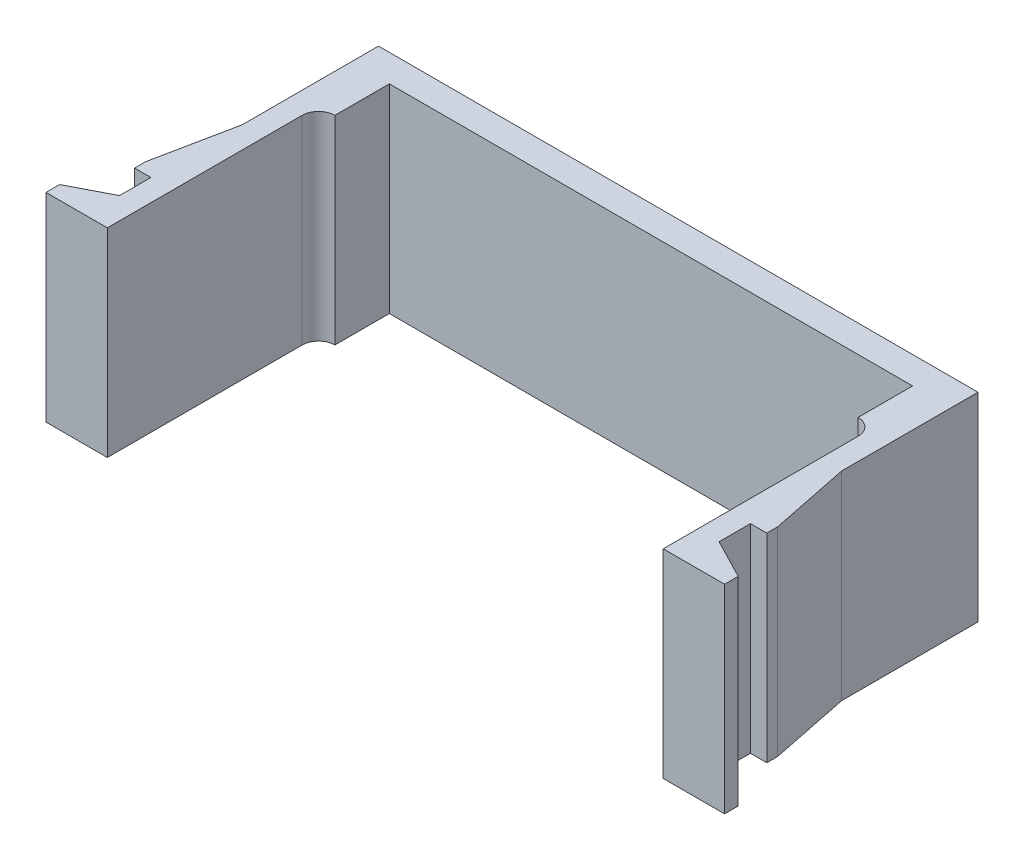
ISO-10303-21;
HEADER;
FILE_DESCRIPTION(('STEP AP214'),'2;1');
FILE_NAME('part.step','',(''),(''),'','','');
FILE_SCHEMA(('AUTOMOTIVE_DESIGN { 1 0 10303 214 1 1 1 1 }'));
ENDSEC;
DATA;
#1=APPLICATION_CONTEXT('core data for automotive mechanical design processes');
#2=APPLICATION_PROTOCOL_DEFINITION('international standard','automotive_design',2000,#1);
#3=PRODUCT_CONTEXT('',#1,'mechanical');
#4=PRODUCT('Part','Part','',(#3));
#5=PRODUCT_RELATED_PRODUCT_CATEGORY('part','',(#4));
#6=PRODUCT_DEFINITION_FORMATION('','',#4);
#7=PRODUCT_DEFINITION_CONTEXT('part definition',#1,'design');
#8=PRODUCT_DEFINITION('design','',#6,#7);
#9=PRODUCT_DEFINITION_SHAPE('','',#8);
#10=(LENGTH_UNIT() NAMED_UNIT(*) SI_UNIT(.MILLI.,.METRE.));
#11=(NAMED_UNIT(*) PLANE_ANGLE_UNIT() SI_UNIT($,.RADIAN.));
#12=(NAMED_UNIT(*) SI_UNIT($,.STERADIAN.) SOLID_ANGLE_UNIT());
#13=UNCERTAINTY_MEASURE_WITH_UNIT(LENGTH_MEASURE(1.E-05),#10,'distance_accuracy_value','');
#14=(GEOMETRIC_REPRESENTATION_CONTEXT(3) GLOBAL_UNCERTAINTY_ASSIGNED_CONTEXT((#13)) GLOBAL_UNIT_ASSIGNED_CONTEXT((#10,
#11,#12)) REPRESENTATION_CONTEXT('',''));
#15=CARTESIAN_POINT('',(0.,0.,0.));
#16=DIRECTION('',(0.,0.,1.));
#17=DIRECTION('',(1.,0.,0.));
#18=AXIS2_PLACEMENT_3D('',#15,#16,#17);
#19=CARTESIAN_POINT('',(0.,0.,2.));
#20=DIRECTION('',(0.,0.,-1.));
#21=DIRECTION('',(-1.,0.,0.));
#22=AXIS2_PLACEMENT_3D('',#19,#20,#21);
#23=PLANE('',#22);
#24=DIRECTION('',(-1.,0.,0.));
#25=VECTOR('',#24,1.);
#26=CARTESIAN_POINT('',(-22.,7.3,2.));
#27=LINE('',#26,#25);
#28=CARTESIAN_POINT('',(19.2,7.3,2.));
#29=VERTEX_POINT('',#28);
#30=CARTESIAN_POINT('',(-19.2,7.3,2.));
#31=VERTEX_POINT('',#30);
#32=EDGE_CURVE('E330',#29,#31,#27,.T.);
#33=ORIENTED_EDGE('',*,*,#32,.T.);
#34=DIRECTION('',(0.,-1.,0.));
#35=VECTOR('',#34,1.);
#36=CARTESIAN_POINT('',(-19.2,-7.3,2.));
#37=LINE('',#36,#35);
#38=CARTESIAN_POINT('',(-19.2,-7.3,2.));
#39=VERTEX_POINT('',#38);
#40=EDGE_CURVE('E251',#31,#39,#37,.T.);
#41=ORIENTED_EDGE('',*,*,#40,.T.);
#42=DIRECTION('',(1.,0.,0.));
#43=VECTOR('',#42,1.);
#44=CARTESIAN_POINT('',(-22.,-7.3,2.));
#45=LINE('',#44,#43);
#46=CARTESIAN_POINT('',(19.2,-7.3,2.));
#47=VERTEX_POINT('',#46);
#48=EDGE_CURVE('E332',#39,#47,#45,.T.);
#49=ORIENTED_EDGE('',*,*,#48,.T.);
#50=DIRECTION('',(0.,-1.,0.));
#51=VECTOR('',#50,1.);
#52=CARTESIAN_POINT('',(19.2,-7.3,2.));
#53=LINE('',#52,#51);
#54=EDGE_CURVE('E317',#29,#47,#53,.T.);
#55=ORIENTED_EDGE('',*,*,#54,.F.);
#56=EDGE_LOOP('',(#33,#41,#49,#55));
#57=FACE_BOUND('',#56,.T.);
#58=ADVANCED_FACE('F35',(#57),#23,.F.);
#59=CARTESIAN_POINT('',(22.,-7.3,2.));
#60=DIRECTION('',(-1.,0.,0.));
#61=DIRECTION('',(0.,0.,1.));
#62=AXIS2_PLACEMENT_3D('',#59,#60,#61);
#63=PLANE('',#62);
#64=DIRECTION('',(0.,1.,0.));
#65=VECTOR('',#64,1.);
#66=CARTESIAN_POINT('',(22.,-7.3,0.));
#67=LINE('',#66,#65);
#68=CARTESIAN_POINT('',(22.,-7.3,0.));
#69=VERTEX_POINT('',#68);
#70=CARTESIAN_POINT('',(22.,7.3,0.));
#71=VERTEX_POINT('',#70);
#72=EDGE_CURVE('E329',#69,#71,#67,.T.);
#73=ORIENTED_EDGE('',*,*,#72,.T.);
#74=DIRECTION('',(0.,0.,-1.));
#75=VECTOR('',#74,1.);
#76=CARTESIAN_POINT('',(22.,7.3,2.));
#77=LINE('',#76,#75);
#78=CARTESIAN_POINT('',(22.,7.3,10.));
#79=VERTEX_POINT('',#78);
#80=EDGE_CURVE('E351',#79,#71,#77,.T.);
#81=ORIENTED_EDGE('',*,*,#80,.F.);
#82=DIRECTION('',(0.,-1.,0.));
#83=VECTOR('',#82,1.);
#84=CARTESIAN_POINT('',(22.,23.440012391569,10.));
#85=LINE('',#84,#83);
#86=CARTESIAN_POINT('',(22.,-7.3,10.));
#87=VERTEX_POINT('',#86);
#88=EDGE_CURVE('E299',#79,#87,#85,.T.);
#89=ORIENTED_EDGE('',*,*,#88,.T.);
#90=DIRECTION('',(0.,0.,-1.));
#91=VECTOR('',#90,1.);
#92=CARTESIAN_POINT('',(22.,-7.3,2.));
#93=LINE('',#92,#91);
#94=EDGE_CURVE('E335',#87,#69,#93,.T.);
#95=ORIENTED_EDGE('',*,*,#94,.T.);
#96=EDGE_LOOP('',(#73,#81,#89,#95));
#97=FACE_BOUND('',#96,.T.);
#98=ADVANCED_FACE('F395',(#97),#63,.F.);
#99=CARTESIAN_POINT('',(-22.,7.3,2.));
#100=DIRECTION('',(0.,-1.,0.));
#101=DIRECTION('',(0.,0.,-1.));
#102=AXIS2_PLACEMENT_3D('',#99,#100,#101);
#103=PLANE('',#102);
#104=DIRECTION('',(-1.,0.,0.));
#105=VECTOR('',#104,1.);
#106=CARTESIAN_POINT('',(-22.,7.3,0.));
#107=LINE('',#106,#105);
#108=CARTESIAN_POINT('',(-22.,7.3,0.));
#109=VERTEX_POINT('',#108);
#110=EDGE_CURVE('E338',#71,#109,#107,.T.);
#111=ORIENTED_EDGE('',*,*,#110,.T.);
#112=DIRECTION('',(0.,0.,-1.));
#113=VECTOR('',#112,1.);
#114=CARTESIAN_POINT('',(-22.,7.3,2.));
#115=LINE('',#114,#113);
#116=CARTESIAN_POINT('',(-22.,7.3,10.));
#117=VERTEX_POINT('',#116);
#118=EDGE_CURVE('E348',#117,#109,#115,.T.);
#119=ORIENTED_EDGE('',*,*,#118,.F.);
#120=DIRECTION('',(0.199309151648976,0.,-0.979936662274132));
#121=VECTOR('',#120,1.);
#122=CARTESIAN_POINT('',(-23.2,7.3,15.9));
#123=LINE('',#122,#121);
#124=CARTESIAN_POINT('',(-23.2,7.3,15.9));
#125=VERTEX_POINT('',#124);
#126=EDGE_CURVE('E215',#125,#117,#123,.T.);
#127=ORIENTED_EDGE('',*,*,#126,.F.);
#128=DIRECTION('',(0.,0.,-1.));
#129=VECTOR('',#128,1.);
#130=CARTESIAN_POINT('',(-23.2,7.3,16.7));
#131=LINE('',#130,#129);
#132=CARTESIAN_POINT('',(-23.2,7.3,16.7));
#133=VERTEX_POINT('',#132);
#134=EDGE_CURVE('E481',#133,#125,#131,.T.);
#135=ORIENTED_EDGE('',*,*,#134,.F.);
#136=DIRECTION('',(-1.,0.,0.));
#137=VECTOR('',#136,1.);
#138=CARTESIAN_POINT('',(-22.,7.3,16.7));
#139=LINE('',#138,#137);
#140=CARTESIAN_POINT('',(-22.,7.3,16.7));
#141=VERTEX_POINT('',#140);
#142=EDGE_CURVE('E485',#141,#133,#139,.T.);
#143=ORIENTED_EDGE('',*,*,#142,.F.);
#144=DIRECTION('',(0.,0.,-1.));
#145=VECTOR('',#144,1.);
#146=CARTESIAN_POINT('',(-22.,7.3,19.));
#147=LINE('',#146,#145);
#148=CARTESIAN_POINT('',(-22.,7.3,19.));
#149=VERTEX_POINT('',#148);
#150=EDGE_CURVE('E487',#149,#141,#147,.T.);
#151=ORIENTED_EDGE('',*,*,#150,.F.);
#152=DIRECTION('',(0.888217643155949,0.,-0.459422918873766));
#153=VECTOR('',#152,1.);
#154=CARTESIAN_POINT('',(-24.9,7.3,20.5));
#155=LINE('',#154,#153);
#156=CARTESIAN_POINT('',(-24.9,7.3,20.5));
#157=VERTEX_POINT('',#156);
#158=EDGE_CURVE('E489',#157,#149,#155,.T.);
#159=ORIENTED_EDGE('',*,*,#158,.F.);
#160=DIRECTION('',(0.,0.,-1.));
#161=VECTOR('',#160,1.);
#162=CARTESIAN_POINT('',(-24.9,7.3,21.5));
#163=LINE('',#162,#161);
#164=CARTESIAN_POINT('',(-24.9,7.3,21.5));
#165=VERTEX_POINT('',#164);
#166=EDGE_CURVE('E494',#165,#157,#163,.T.);
#167=ORIENTED_EDGE('',*,*,#166,.F.);
#168=DIRECTION('',(-1.,0.,0.));
#169=VECTOR('',#168,1.);
#170=CARTESIAN_POINT('',(-20.4,7.3,21.5));
#171=LINE('',#170,#169);
#172=CARTESIAN_POINT('',(-20.4,7.3,21.5));
#173=VERTEX_POINT('',#172);
#174=EDGE_CURVE('E497',#173,#165,#171,.T.);
#175=ORIENTED_EDGE('',*,*,#174,.F.);
#176=DIRECTION('',(0.,0.,1.));
#177=VECTOR('',#176,1.);
#178=CARTESIAN_POINT('',(-20.4,7.3,6.));
#179=LINE('',#178,#177);
#180=CARTESIAN_POINT('',(-20.4,7.3,7.2));
#181=VERTEX_POINT('',#180);
#182=EDGE_CURVE('E197',#181,#173,#179,.T.);
#183=ORIENTED_EDGE('',*,*,#182,.F.);
#184=CARTESIAN_POINT('',(-19.2,7.3,7.2));
#185=DIRECTION('',(0.,-1.,0.));
#186=DIRECTION('',(0.,0.,-1.));
#187=AXIS2_PLACEMENT_3D('',#184,#185,#186);
#188=CIRCLE('',#187,1.2);
#189=CARTESIAN_POINT('',(-19.2,7.3,6.));
#190=VERTEX_POINT('',#189);
#191=EDGE_CURVE('E11',#181,#190,#188,.T.);
#192=ORIENTED_EDGE('',*,*,#191,.T.);
#193=DIRECTION('',(0.,0.,-1.));
#194=VECTOR('',#193,1.);
#195=CARTESIAN_POINT('',(-19.2,7.3,6.));
#196=LINE('',#195,#194);
#197=EDGE_CURVE('E250',#190,#31,#196,.T.);
#198=ORIENTED_EDGE('',*,*,#197,.T.);
#199=ORIENTED_EDGE('',*,*,#32,.F.);
#200=DIRECTION('',(0.,0.,-1.));
#201=VECTOR('',#200,1.);
#202=CARTESIAN_POINT('',(19.2,7.3,6.));
#203=LINE('',#202,#201);
#204=CARTESIAN_POINT('',(19.2,7.3,6.));
#205=VERTEX_POINT('',#204);
#206=EDGE_CURVE('E326',#205,#29,#203,.T.);
#207=ORIENTED_EDGE('',*,*,#206,.F.);
#208=CARTESIAN_POINT('',(19.2,7.3,7.2));
#209=DIRECTION('',(0.,-1.,0.));
#210=DIRECTION('',(0.,0.,-1.));
#211=AXIS2_PLACEMENT_3D('',#208,#209,#210);
#212=CIRCLE('',#211,1.2);
#213=CARTESIAN_POINT('',(20.4,7.3,7.2));
#214=VERTEX_POINT('',#213);
#215=EDGE_CURVE('E359',#205,#214,#212,.T.);
#216=ORIENTED_EDGE('',*,*,#215,.T.);
#217=DIRECTION('',(0.,0.,1.));
#218=VECTOR('',#217,1.);
#219=CARTESIAN_POINT('',(20.4,7.3,6.));
#220=LINE('',#219,#218);
#221=CARTESIAN_POINT('',(20.4,7.3,21.5));
#222=VERTEX_POINT('',#221);
#223=EDGE_CURVE('E273',#214,#222,#220,.T.);
#224=ORIENTED_EDGE('',*,*,#223,.T.);
#225=DIRECTION('',(1.,0.,0.));
#226=VECTOR('',#225,1.);
#227=CARTESIAN_POINT('',(20.4,7.3,21.5));
#228=LINE('',#227,#226);
#229=CARTESIAN_POINT('',(24.9,7.3,21.5));
#230=VERTEX_POINT('',#229);
#231=EDGE_CURVE('E271',#222,#230,#228,.T.);
#232=ORIENTED_EDGE('',*,*,#231,.T.);
#233=DIRECTION('',(0.,0.,-1.));
#234=VECTOR('',#233,1.);
#235=CARTESIAN_POINT('',(24.9,7.3,21.5));
#236=LINE('',#235,#234);
#237=CARTESIAN_POINT('',(24.9,7.3,20.5));
#238=VERTEX_POINT('',#237);
#239=EDGE_CURVE('E269',#230,#238,#236,.T.);
#240=ORIENTED_EDGE('',*,*,#239,.T.);
#241=DIRECTION('',(-0.888217643155949,0.,-0.459422918873766));
#242=VECTOR('',#241,1.);
#243=CARTESIAN_POINT('',(24.9,7.3,20.5));
#244=LINE('',#243,#242);
#245=CARTESIAN_POINT('',(22.,7.3,19.));
#246=VERTEX_POINT('',#245);
#247=EDGE_CURVE('E267',#238,#246,#244,.T.);
#248=ORIENTED_EDGE('',*,*,#247,.T.);
#249=DIRECTION('',(0.,0.,-1.));
#250=VECTOR('',#249,1.);
#251=CARTESIAN_POINT('',(22.,7.3,19.));
#252=LINE('',#251,#250);
#253=CARTESIAN_POINT('',(22.,7.3,16.7));
#254=VERTEX_POINT('',#253);
#255=EDGE_CURVE('E265',#246,#254,#252,.T.);
#256=ORIENTED_EDGE('',*,*,#255,.T.);
#257=DIRECTION('',(1.,0.,0.));
#258=VECTOR('',#257,1.);
#259=CARTESIAN_POINT('',(22.,7.3,16.7));
#260=LINE('',#259,#258);
#261=CARTESIAN_POINT('',(23.2,7.3,16.7));
#262=VERTEX_POINT('',#261);
#263=EDGE_CURVE('E262',#254,#262,#260,.T.);
#264=ORIENTED_EDGE('',*,*,#263,.T.);
#265=DIRECTION('',(0.,0.,-1.));
#266=VECTOR('',#265,1.);
#267=CARTESIAN_POINT('',(23.2,7.3,16.7));
#268=LINE('',#267,#266);
#269=CARTESIAN_POINT('',(23.2,7.3,15.9));
#270=VERTEX_POINT('',#269);
#271=EDGE_CURVE('E260',#262,#270,#268,.T.);
#272=ORIENTED_EDGE('',*,*,#271,.T.);
#273=DIRECTION('',(-0.199309151648976,0.,-0.979936662274132));
#274=VECTOR('',#273,1.);
#275=CARTESIAN_POINT('',(23.2,7.3,15.9));
#276=LINE('',#275,#274);
#277=EDGE_CURVE('E275',#270,#79,#276,.T.);
#278=ORIENTED_EDGE('',*,*,#277,.T.);
#279=ORIENTED_EDGE('',*,*,#80,.T.);
#280=EDGE_LOOP('',(#111,#119,#127,#135,#143,#151,#159,#167,#175,#183,#192,#198,#199,#207,#216,
#224,#232,#240,#248,#256,#264,#272,#278,#279));
#281=FACE_BOUND('',#280,.T.);
#282=ADVANCED_FACE('F364',(#281),#103,.F.);
#283=CARTESIAN_POINT('',(-22.,-7.3,2.));
#284=DIRECTION('',(1.,0.,0.));
#285=DIRECTION('',(0.,0.,-1.));
#286=AXIS2_PLACEMENT_3D('',#283,#284,#285);
#287=PLANE('',#286);
#288=DIRECTION('',(0.,-1.,0.));
#289=VECTOR('',#288,1.);
#290=CARTESIAN_POINT('',(-22.,-7.3,0.));
#291=LINE('',#290,#289);
#292=CARTESIAN_POINT('',(-22.,-7.3,0.));
#293=VERTEX_POINT('',#292);
#294=EDGE_CURVE('E340',#109,#293,#291,.T.);
#295=ORIENTED_EDGE('',*,*,#294,.T.);
#296=DIRECTION('',(0.,0.,-1.));
#297=VECTOR('',#296,1.);
#298=CARTESIAN_POINT('',(-22.,-7.3,2.));
#299=LINE('',#298,#297);
#300=CARTESIAN_POINT('',(-22.,-7.3,10.));
#301=VERTEX_POINT('',#300);
#302=EDGE_CURVE('E345',#301,#293,#299,.T.);
#303=ORIENTED_EDGE('',*,*,#302,.F.);
#304=DIRECTION('',(0.,-1.,0.));
#305=VECTOR('',#304,1.);
#306=CARTESIAN_POINT('',(-22.,23.440012391569,10.));
#307=LINE('',#306,#305);
#308=EDGE_CURVE('E233',#117,#301,#307,.T.);
#309=ORIENTED_EDGE('',*,*,#308,.F.);
#310=ORIENTED_EDGE('',*,*,#118,.T.);
#311=EDGE_LOOP('',(#295,#303,#309,#310));
#312=FACE_BOUND('',#311,.T.);
#313=ADVANCED_FACE('F411',(#312),#287,.F.);
#314=CARTESIAN_POINT('',(-22.,-7.3,2.));
#315=DIRECTION('',(0.,1.,0.));
#316=DIRECTION('',(0.,0.,1.));
#317=AXIS2_PLACEMENT_3D('',#314,#315,#316);
#318=PLANE('',#317);
#319=DIRECTION('',(1.,0.,0.));
#320=VECTOR('',#319,1.);
#321=CARTESIAN_POINT('',(-22.,-7.3,0.));
#322=LINE('',#321,#320);
#323=EDGE_CURVE('E333',#293,#69,#322,.T.);
#324=ORIENTED_EDGE('',*,*,#323,.T.);
#325=ORIENTED_EDGE('',*,*,#94,.F.);
#326=DIRECTION('',(0.199309151648976,0.,0.979936662274132));
#327=VECTOR('',#326,1.);
#328=CARTESIAN_POINT('',(23.2,-7.3,15.9));
#329=LINE('',#328,#327);
#330=CARTESIAN_POINT('',(23.2,-7.3,15.9));
#331=VERTEX_POINT('',#330);
#332=EDGE_CURVE('E259',#87,#331,#329,.T.);
#333=ORIENTED_EDGE('',*,*,#332,.T.);
#334=DIRECTION('',(0.,0.,1.));
#335=VECTOR('',#334,1.);
#336=CARTESIAN_POINT('',(23.2,-7.3,16.7));
#337=LINE('',#336,#335);
#338=CARTESIAN_POINT('',(23.2,-7.3,16.7));
#339=VERTEX_POINT('',#338);
#340=EDGE_CURVE('E278',#331,#339,#337,.T.);
#341=ORIENTED_EDGE('',*,*,#340,.T.);
#342=DIRECTION('',(-1.,0.,0.));
#343=VECTOR('',#342,1.);
#344=CARTESIAN_POINT('',(22.,-7.3,16.7));
#345=LINE('',#344,#343);
#346=CARTESIAN_POINT('',(22.,-7.3,16.7));
#347=VERTEX_POINT('',#346);
#348=EDGE_CURVE('E281',#339,#347,#345,.T.);
#349=ORIENTED_EDGE('',*,*,#348,.T.);
#350=DIRECTION('',(0.,0.,1.));
#351=VECTOR('',#350,1.);
#352=CARTESIAN_POINT('',(22.,-7.3,19.));
#353=LINE('',#352,#351);
#354=CARTESIAN_POINT('',(22.,-7.3,19.));
#355=VERTEX_POINT('',#354);
#356=EDGE_CURVE('E284',#347,#355,#353,.T.);
#357=ORIENTED_EDGE('',*,*,#356,.T.);
#358=DIRECTION('',(0.888217643155949,0.,0.459422918873766));
#359=VECTOR('',#358,1.);
#360=CARTESIAN_POINT('',(24.9,-7.3,20.5));
#361=LINE('',#360,#359);
#362=CARTESIAN_POINT('',(24.9,-7.3,20.5));
#363=VERTEX_POINT('',#362);
#364=EDGE_CURVE('E287',#355,#363,#361,.T.);
#365=ORIENTED_EDGE('',*,*,#364,.T.);
#366=DIRECTION('',(0.,0.,1.));
#367=VECTOR('',#366,1.);
#368=CARTESIAN_POINT('',(24.9,-7.3,21.5));
#369=LINE('',#368,#367);
#370=CARTESIAN_POINT('',(24.9,-7.3,21.5));
#371=VERTEX_POINT('',#370);
#372=EDGE_CURVE('E290',#363,#371,#369,.T.);
#373=ORIENTED_EDGE('',*,*,#372,.T.);
#374=DIRECTION('',(-1.,0.,0.));
#375=VECTOR('',#374,1.);
#376=CARTESIAN_POINT('',(20.4,-7.3,21.5));
#377=LINE('',#376,#375);
#378=CARTESIAN_POINT('',(20.4,-7.3,21.5));
#379=VERTEX_POINT('',#378);
#380=EDGE_CURVE('E293',#371,#379,#377,.T.);
#381=ORIENTED_EDGE('',*,*,#380,.T.);
#382=DIRECTION('',(0.,0.,-1.));
#383=VECTOR('',#382,1.);
#384=CARTESIAN_POINT('',(20.4,-7.3,6.));
#385=LINE('',#384,#383);
#386=CARTESIAN_POINT('',(20.4,-7.3,7.2));
#387=VERTEX_POINT('',#386);
#388=EDGE_CURVE('E296',#379,#387,#385,.T.);
#389=ORIENTED_EDGE('',*,*,#388,.T.);
#390=CARTESIAN_POINT('',(19.2,-7.3,7.2));
#391=DIRECTION('',(0.,1.,0.));
#392=DIRECTION('',(0.,0.,1.));
#393=AXIS2_PLACEMENT_3D('',#390,#391,#392);
#394=CIRCLE('',#393,1.2);
#395=CARTESIAN_POINT('',(19.2,-7.3,6.));
#396=VERTEX_POINT('',#395);
#397=EDGE_CURVE('E357',#387,#396,#394,.T.);
#398=ORIENTED_EDGE('',*,*,#397,.T.);
#399=DIRECTION('',(0.,0.,-1.));
#400=VECTOR('',#399,1.);
#401=CARTESIAN_POINT('',(19.2,-7.3,6.));
#402=LINE('',#401,#400);
#403=EDGE_CURVE('E321',#396,#47,#402,.T.);
#404=ORIENTED_EDGE('',*,*,#403,.T.);
#405=ORIENTED_EDGE('',*,*,#48,.F.);
#406=DIRECTION('',(0.,0.,-1.));
#407=VECTOR('',#406,1.);
#408=CARTESIAN_POINT('',(-19.2,-7.3,6.));
#409=LINE('',#408,#407);
#410=CARTESIAN_POINT('',(-19.2,-7.3,6.));
#411=VERTEX_POINT('',#410);
#412=EDGE_CURVE('E256',#411,#39,#409,.T.);
#413=ORIENTED_EDGE('',*,*,#412,.F.);
#414=CARTESIAN_POINT('',(-19.2,-7.3,7.2));
#415=DIRECTION('',(0.,1.,0.));
#416=DIRECTION('',(0.,0.,1.));
#417=AXIS2_PLACEMENT_3D('',#414,#415,#416);
#418=CIRCLE('',#417,1.2);
#419=CARTESIAN_POINT('',(-20.4,-7.3,7.2));
#420=VERTEX_POINT('',#419);
#421=EDGE_CURVE('E43',#411,#420,#418,.T.);
#422=ORIENTED_EDGE('',*,*,#421,.T.);
#423=DIRECTION('',(0.,0.,-1.));
#424=VECTOR('',#423,1.);
#425=CARTESIAN_POINT('',(-20.4,-7.3,6.));
#426=LINE('',#425,#424);
#427=CARTESIAN_POINT('',(-20.4,-7.3,21.5));
#428=VERTEX_POINT('',#427);
#429=EDGE_CURVE('E196',#428,#420,#426,.T.);
#430=ORIENTED_EDGE('',*,*,#429,.F.);
#431=DIRECTION('',(1.,0.,0.));
#432=VECTOR('',#431,1.);
#433=CARTESIAN_POINT('',(-20.4,-7.3,21.5));
#434=LINE('',#433,#432);
#435=CARTESIAN_POINT('',(-24.9,-7.3,21.5));
#436=VERTEX_POINT('',#435);
#437=EDGE_CURVE('E205',#436,#428,#434,.T.);
#438=ORIENTED_EDGE('',*,*,#437,.F.);
#439=DIRECTION('',(0.,0.,1.));
#440=VECTOR('',#439,1.);
#441=CARTESIAN_POINT('',(-24.9,-7.3,21.5));
#442=LINE('',#441,#440);
#443=CARTESIAN_POINT('',(-24.9,-7.3,20.5));
#444=VERTEX_POINT('',#443);
#445=EDGE_CURVE('E210',#444,#436,#442,.T.);
#446=ORIENTED_EDGE('',*,*,#445,.F.);
#447=DIRECTION('',(-0.888217643155949,0.,0.459422918873766));
#448=VECTOR('',#447,1.);
#449=CARTESIAN_POINT('',(-24.9,-7.3,20.5));
#450=LINE('',#449,#448);
#451=CARTESIAN_POINT('',(-22.,-7.3,19.));
#452=VERTEX_POINT('',#451);
#453=EDGE_CURVE('E219',#452,#444,#450,.T.);
#454=ORIENTED_EDGE('',*,*,#453,.F.);
#455=DIRECTION('',(0.,0.,1.));
#456=VECTOR('',#455,1.);
#457=CARTESIAN_POINT('',(-22.,-7.3,19.));
#458=LINE('',#457,#456);
#459=CARTESIAN_POINT('',(-22.,-7.3,16.7));
#460=VERTEX_POINT('',#459);
#461=EDGE_CURVE('E222',#460,#452,#458,.T.);
#462=ORIENTED_EDGE('',*,*,#461,.F.);
#463=DIRECTION('',(1.,0.,0.));
#464=VECTOR('',#463,1.);
#465=CARTESIAN_POINT('',(-22.,-7.3,16.7));
#466=LINE('',#465,#464);
#467=CARTESIAN_POINT('',(-23.2,-7.3,16.7));
#468=VERTEX_POINT('',#467);
#469=EDGE_CURVE('E225',#468,#460,#466,.T.);
#470=ORIENTED_EDGE('',*,*,#469,.F.);
#471=DIRECTION('',(0.,0.,1.));
#472=VECTOR('',#471,1.);
#473=CARTESIAN_POINT('',(-23.2,-7.3,16.7));
#474=LINE('',#473,#472);
#475=CARTESIAN_POINT('',(-23.2,-7.3,15.9));
#476=VERTEX_POINT('',#475);
#477=EDGE_CURVE('E228',#476,#468,#474,.T.);
#478=ORIENTED_EDGE('',*,*,#477,.F.);
#479=DIRECTION('',(-0.199309151648976,0.,0.979936662274132));
#480=VECTOR('',#479,1.);
#481=CARTESIAN_POINT('',(-23.2,-7.3,15.9));
#482=LINE('',#481,#480);
#483=EDGE_CURVE('E202',#301,#476,#482,.T.);
#484=ORIENTED_EDGE('',*,*,#483,.F.);
#485=ORIENTED_EDGE('',*,*,#302,.T.);
#486=EDGE_LOOP('',(#324,#325,#333,#341,#349,#357,#365,#373,#381,#389,#398,#404,#405,#413,#422,
#430,#438,#446,#454,#462,#470,#478,#484,#485));
#487=FACE_BOUND('',#486,.T.);
#488=ADVANCED_FACE('F212',(#487),#318,.F.);
#489=CARTESIAN_POINT('',(0.,0.,0.));
#490=DIRECTION('',(0.,0.,-1.));
#491=DIRECTION('',(-1.,0.,0.));
#492=AXIS2_PLACEMENT_3D('',#489,#490,#491);
#493=PLANE('',#492);
#494=ORIENTED_EDGE('',*,*,#72,.F.);
#495=ORIENTED_EDGE('',*,*,#323,.F.);
#496=ORIENTED_EDGE('',*,*,#294,.F.);
#497=ORIENTED_EDGE('',*,*,#110,.F.);
#498=EDGE_LOOP('',(#494,#495,#496,#497));
#499=FACE_BOUND('',#498,.T.);
#500=ADVANCED_FACE('F405',(#499),#493,.T.);
#501=CARTESIAN_POINT('',(19.2,-7.3,6.));
#502=DIRECTION('',(1.,0.,0.));
#503=DIRECTION('',(0.,0.,-1.));
#504=AXIS2_PLACEMENT_3D('',#501,#502,#503);
#505=PLANE('',#504);
#506=ORIENTED_EDGE('',*,*,#54,.T.);
#507=ORIENTED_EDGE('',*,*,#403,.F.);
#508=DIRECTION('',(0.,-1.,0.));
#509=VECTOR('',#508,1.);
#510=CARTESIAN_POINT('',(19.2,-7.3,6.));
#511=LINE('',#510,#509);
#512=EDGE_CURVE('E318',#205,#396,#511,.T.);
#513=ORIENTED_EDGE('',*,*,#512,.F.);
#514=ORIENTED_EDGE('',*,*,#206,.T.);
#515=EDGE_LOOP('',(#506,#507,#513,#514));
#516=FACE_BOUND('',#515,.T.);
#517=ADVANCED_FACE('F377',(#516),#505,.F.);
#518=CARTESIAN_POINT('',(20.4,23.440012391569,6.));
#519=DIRECTION('',(-1.,0.,0.));
#520=DIRECTION('',(0.,0.,1.));
#521=AXIS2_PLACEMENT_3D('',#518,#519,#520);
#522=PLANE('',#521);
#523=ORIENTED_EDGE('',*,*,#223,.F.);
#524=DIRECTION('',(0.,-1.,0.));
#525=VECTOR('',#524,1.);
#526=CARTESIAN_POINT('',(20.4,-7.3,7.2));
#527=LINE('',#526,#525);
#528=EDGE_CURVE('E354',#214,#387,#527,.T.);
#529=ORIENTED_EDGE('',*,*,#528,.T.);
#530=ORIENTED_EDGE('',*,*,#388,.F.);
#531=DIRECTION('',(0.,-1.,0.));
#532=VECTOR('',#531,1.);
#533=CARTESIAN_POINT('',(20.4,23.440012391569,21.5));
#534=LINE('',#533,#532);
#535=EDGE_CURVE('E263',#222,#379,#534,.T.);
#536=ORIENTED_EDGE('',*,*,#535,.F.);
#537=EDGE_LOOP('',(#523,#529,#530,#536));
#538=FACE_BOUND('',#537,.T.);
#539=ADVANCED_FACE('F372',(#538),#522,.T.);
#540=CARTESIAN_POINT('',(20.4,23.440012391569,21.5));
#541=DIRECTION('',(0.,0.,1.));
#542=DIRECTION('',(1.,0.,0.));
#543=AXIS2_PLACEMENT_3D('',#540,#541,#542);
#544=PLANE('',#543);
#545=ORIENTED_EDGE('',*,*,#231,.F.);
#546=ORIENTED_EDGE('',*,*,#535,.T.);
#547=ORIENTED_EDGE('',*,*,#380,.F.);
#548=DIRECTION('',(0.,-1.,0.));
#549=VECTOR('',#548,1.);
#550=CARTESIAN_POINT('',(24.9,23.440012391569,21.5));
#551=LINE('',#550,#549);
#552=EDGE_CURVE('E301',#230,#371,#551,.T.);
#553=ORIENTED_EDGE('',*,*,#552,.F.);
#554=EDGE_LOOP('',(#545,#546,#547,#553));
#555=FACE_BOUND('',#554,.T.);
#556=ADVANCED_FACE('F447',(#555),#544,.T.);
#557=CARTESIAN_POINT('',(24.9,23.440012391569,21.5));
#558=DIRECTION('',(1.,0.,0.));
#559=DIRECTION('',(0.,0.,-1.));
#560=AXIS2_PLACEMENT_3D('',#557,#558,#559);
#561=PLANE('',#560);
#562=ORIENTED_EDGE('',*,*,#239,.F.);
#563=ORIENTED_EDGE('',*,*,#552,.T.);
#564=ORIENTED_EDGE('',*,*,#372,.F.);
#565=DIRECTION('',(0.,-1.,0.));
#566=VECTOR('',#565,1.);
#567=CARTESIAN_POINT('',(24.9,23.440012391569,20.5));
#568=LINE('',#567,#566);
#569=EDGE_CURVE('E303',#238,#363,#568,.T.);
#570=ORIENTED_EDGE('',*,*,#569,.F.);
#571=EDGE_LOOP('',(#562,#563,#564,#570));
#572=FACE_BOUND('',#571,.T.);
#573=ADVANCED_FACE('F443',(#572),#561,.T.);
#574=CARTESIAN_POINT('',(24.9,23.440012391569,20.5));
#575=DIRECTION('',(0.459422918873766,0.,-0.888217643155949));
#576=DIRECTION('',(-0.888217643155949,0.,-0.459422918873766));
#577=AXIS2_PLACEMENT_3D('',#574,#575,#576);
#578=PLANE('',#577);
#579=ORIENTED_EDGE('',*,*,#247,.F.);
#580=ORIENTED_EDGE('',*,*,#569,.T.);
#581=ORIENTED_EDGE('',*,*,#364,.F.);
#582=DIRECTION('',(0.,-1.,0.));
#583=VECTOR('',#582,1.);
#584=CARTESIAN_POINT('',(22.,23.440012391569,19.));
#585=LINE('',#584,#583);
#586=EDGE_CURVE('E305',#246,#355,#585,.T.);
#587=ORIENTED_EDGE('',*,*,#586,.F.);
#588=EDGE_LOOP('',(#579,#580,#581,#587));
#589=FACE_BOUND('',#588,.T.);
#590=ADVANCED_FACE('F439',(#589),#578,.T.);
#591=CARTESIAN_POINT('',(22.,23.440012391569,19.));
#592=DIRECTION('',(1.,0.,0.));
#593=DIRECTION('',(0.,0.,-1.));
#594=AXIS2_PLACEMENT_3D('',#591,#592,#593);
#595=PLANE('',#594);
#596=ORIENTED_EDGE('',*,*,#255,.F.);
#597=ORIENTED_EDGE('',*,*,#586,.T.);
#598=ORIENTED_EDGE('',*,*,#356,.F.);
#599=DIRECTION('',(0.,-1.,0.));
#600=VECTOR('',#599,1.);
#601=CARTESIAN_POINT('',(22.,23.440012391569,16.7));
#602=LINE('',#601,#600);
#603=EDGE_CURVE('E307',#254,#347,#602,.T.);
#604=ORIENTED_EDGE('',*,*,#603,.F.);
#605=EDGE_LOOP('',(#596,#597,#598,#604));
#606=FACE_BOUND('',#605,.T.);
#607=ADVANCED_FACE('F435',(#606),#595,.T.);
#608=CARTESIAN_POINT('',(22.,23.440012391569,16.7));
#609=DIRECTION('',(0.,0.,1.));
#610=DIRECTION('',(1.,0.,0.));
#611=AXIS2_PLACEMENT_3D('',#608,#609,#610);
#612=PLANE('',#611);
#613=ORIENTED_EDGE('',*,*,#263,.F.);
#614=ORIENTED_EDGE('',*,*,#603,.T.);
#615=ORIENTED_EDGE('',*,*,#348,.F.);
#616=DIRECTION('',(0.,-1.,0.));
#617=VECTOR('',#616,1.);
#618=CARTESIAN_POINT('',(23.2,23.440012391569,16.7));
#619=LINE('',#618,#617);
#620=EDGE_CURVE('E309',#262,#339,#619,.T.);
#621=ORIENTED_EDGE('',*,*,#620,.F.);
#622=EDGE_LOOP('',(#613,#614,#615,#621));
#623=FACE_BOUND('',#622,.T.);
#624=ADVANCED_FACE('F428',(#623),#612,.T.);
#625=CARTESIAN_POINT('',(23.2,23.440012391569,16.7));
#626=DIRECTION('',(1.,0.,0.));
#627=DIRECTION('',(0.,0.,-1.));
#628=AXIS2_PLACEMENT_3D('',#625,#626,#627);
#629=PLANE('',#628);
#630=ORIENTED_EDGE('',*,*,#271,.F.);
#631=ORIENTED_EDGE('',*,*,#620,.T.);
#632=ORIENTED_EDGE('',*,*,#340,.F.);
#633=DIRECTION('',(0.,-1.,0.));
#634=VECTOR('',#633,1.);
#635=CARTESIAN_POINT('',(23.2,23.440012391569,15.9));
#636=LINE('',#635,#634);
#637=EDGE_CURVE('E311',#270,#331,#636,.T.);
#638=ORIENTED_EDGE('',*,*,#637,.F.);
#639=EDGE_LOOP('',(#630,#631,#632,#638));
#640=FACE_BOUND('',#639,.T.);
#641=ADVANCED_FACE('F423',(#640),#629,.T.);
#642=CARTESIAN_POINT('',(23.2,23.440012391569,15.9));
#643=DIRECTION('',(0.979936662274132,0.,-0.199309151648976));
#644=DIRECTION('',(-0.199309151648976,0.,-0.979936662274132));
#645=AXIS2_PLACEMENT_3D('',#642,#643,#644);
#646=PLANE('',#645);
#647=ORIENTED_EDGE('',*,*,#277,.F.);
#648=ORIENTED_EDGE('',*,*,#637,.T.);
#649=ORIENTED_EDGE('',*,*,#332,.F.);
#650=ORIENTED_EDGE('',*,*,#88,.F.);
#651=EDGE_LOOP('',(#647,#648,#649,#650));
#652=FACE_BOUND('',#651,.T.);
#653=ADVANCED_FACE('F417',(#652),#646,.T.);
#654=CARTESIAN_POINT('',(19.2,23.440012391569,7.2));
#655=DIRECTION('',(0.,1.,0.));
#656=DIRECTION('',(0.,0.,1.));
#657=AXIS2_PLACEMENT_3D('',#654,#655,#656);
#658=CYLINDRICAL_SURFACE('',#657,1.2);
#659=ORIENTED_EDGE('',*,*,#215,.F.);
#660=ORIENTED_EDGE('',*,*,#512,.T.);
#661=ORIENTED_EDGE('',*,*,#397,.F.);
#662=ORIENTED_EDGE('',*,*,#528,.F.);
#663=EDGE_LOOP('',(#659,#660,#661,#662));
#664=FACE_BOUND('',#663,.T.);
#665=ADVANCED_FACE('F374',(#664),#658,.F.);
#666=CARTESIAN_POINT('',(-19.2,-7.3,6.));
#667=DIRECTION('',(1.,0.,0.));
#668=DIRECTION('',(0.,0.,-1.));
#669=AXIS2_PLACEMENT_3D('',#666,#667,#668);
#670=PLANE('',#669);
#671=ORIENTED_EDGE('',*,*,#40,.F.);
#672=ORIENTED_EDGE('',*,*,#197,.F.);
#673=DIRECTION('',(0.,-1.,0.));
#674=VECTOR('',#673,1.);
#675=CARTESIAN_POINT('',(-19.2,-7.3,6.));
#676=LINE('',#675,#674);
#677=EDGE_CURVE('E247',#190,#411,#676,.T.);
#678=ORIENTED_EDGE('',*,*,#677,.T.);
#679=ORIENTED_EDGE('',*,*,#412,.T.);
#680=EDGE_LOOP('',(#671,#672,#678,#679));
#681=FACE_BOUND('',#680,.T.);
#682=ADVANCED_FACE('F384',(#681),#670,.T.);
#683=CARTESIAN_POINT('',(-20.4,23.440012391569,6.));
#684=DIRECTION('',(-1.,0.,0.));
#685=DIRECTION('',(0.,0.,1.));
#686=AXIS2_PLACEMENT_3D('',#683,#684,#685);
#687=PLANE('',#686);
#688=ORIENTED_EDGE('',*,*,#429,.T.);
#689=DIRECTION('',(0.,-1.,0.));
#690=VECTOR('',#689,1.);
#691=CARTESIAN_POINT('',(-20.4,23.440012391569,7.2));
#692=LINE('',#691,#690);
#693=EDGE_CURVE('E56',#420,#181,#692,.F.);
#694=ORIENTED_EDGE('',*,*,#693,.T.);
#695=ORIENTED_EDGE('',*,*,#182,.T.);
#696=DIRECTION('',(0.,-1.,0.));
#697=VECTOR('',#696,1.);
#698=CARTESIAN_POINT('',(-20.4,23.440012391569,21.5));
#699=LINE('',#698,#697);
#700=EDGE_CURVE('E193',#173,#428,#699,.T.);
#701=ORIENTED_EDGE('',*,*,#700,.T.);
#702=EDGE_LOOP('',(#688,#694,#695,#701));
#703=FACE_BOUND('',#702,.T.);
#704=ADVANCED_FACE('F195',(#703),#687,.F.);
#705=CARTESIAN_POINT('',(-20.4,23.440012391569,21.5));
#706=DIRECTION('',(0.,0.,-1.));
#707=DIRECTION('',(-1.,0.,0.));
#708=AXIS2_PLACEMENT_3D('',#705,#706,#707);
#709=PLANE('',#708);
#710=ORIENTED_EDGE('',*,*,#700,.F.);
#711=ORIENTED_EDGE('',*,*,#174,.T.);
#712=DIRECTION('',(0.,-1.,0.));
#713=VECTOR('',#712,1.);
#714=CARTESIAN_POINT('',(-24.9,23.440012391569,21.5));
#715=LINE('',#714,#713);
#716=EDGE_CURVE('E201',#165,#436,#715,.T.);
#717=ORIENTED_EDGE('',*,*,#716,.T.);
#718=ORIENTED_EDGE('',*,*,#437,.T.);
#719=EDGE_LOOP('',(#710,#711,#717,#718));
#720=FACE_BOUND('',#719,.T.);
#721=ADVANCED_FACE('F206',(#720),#709,.F.);
#722=CARTESIAN_POINT('',(-24.9,23.440012391569,21.5));
#723=DIRECTION('',(1.,0.,0.));
#724=DIRECTION('',(0.,0.,-1.));
#725=AXIS2_PLACEMENT_3D('',#722,#723,#724);
#726=PLANE('',#725);
#727=ORIENTED_EDGE('',*,*,#716,.F.);
#728=ORIENTED_EDGE('',*,*,#166,.T.);
#729=DIRECTION('',(0.,-1.,0.));
#730=VECTOR('',#729,1.);
#731=CARTESIAN_POINT('',(-24.9,23.440012391569,20.5));
#732=LINE('',#731,#730);
#733=EDGE_CURVE('E244',#157,#444,#732,.T.);
#734=ORIENTED_EDGE('',*,*,#733,.T.);
#735=ORIENTED_EDGE('',*,*,#445,.T.);
#736=EDGE_LOOP('',(#727,#728,#734,#735));
#737=FACE_BOUND('',#736,.T.);
#738=ADVANCED_FACE('F458',(#737),#726,.F.);
#739=CARTESIAN_POINT('',(-24.9,23.440012391569,20.5));
#740=DIRECTION('',(0.459422918873766,0.,0.888217643155949));
#741=DIRECTION('',(0.888217643155949,0.,-0.459422918873766));
#742=AXIS2_PLACEMENT_3D('',#739,#740,#741);
#743=PLANE('',#742);
#744=ORIENTED_EDGE('',*,*,#733,.F.);
#745=ORIENTED_EDGE('',*,*,#158,.T.);
#746=DIRECTION('',(0.,-1.,0.));
#747=VECTOR('',#746,1.);
#748=CARTESIAN_POINT('',(-22.,23.440012391569,19.));
#749=LINE('',#748,#747);
#750=EDGE_CURVE('E242',#149,#452,#749,.T.);
#751=ORIENTED_EDGE('',*,*,#750,.T.);
#752=ORIENTED_EDGE('',*,*,#453,.T.);
#753=EDGE_LOOP('',(#744,#745,#751,#752));
#754=FACE_BOUND('',#753,.T.);
#755=ADVANCED_FACE('F461',(#754),#743,.F.);
#756=CARTESIAN_POINT('',(-22.,23.440012391569,19.));
#757=DIRECTION('',(1.,0.,0.));
#758=DIRECTION('',(0.,0.,-1.));
#759=AXIS2_PLACEMENT_3D('',#756,#757,#758);
#760=PLANE('',#759);
#761=ORIENTED_EDGE('',*,*,#750,.F.);
#762=ORIENTED_EDGE('',*,*,#150,.T.);
#763=DIRECTION('',(0.,-1.,0.));
#764=VECTOR('',#763,1.);
#765=CARTESIAN_POINT('',(-22.,23.440012391569,16.7));
#766=LINE('',#765,#764);
#767=EDGE_CURVE('E240',#141,#460,#766,.T.);
#768=ORIENTED_EDGE('',*,*,#767,.T.);
#769=ORIENTED_EDGE('',*,*,#461,.T.);
#770=EDGE_LOOP('',(#761,#762,#768,#769));
#771=FACE_BOUND('',#770,.T.);
#772=ADVANCED_FACE('F465',(#771),#760,.F.);
#773=CARTESIAN_POINT('',(-22.,23.440012391569,16.7));
#774=DIRECTION('',(0.,0.,-1.));
#775=DIRECTION('',(-1.,0.,0.));
#776=AXIS2_PLACEMENT_3D('',#773,#774,#775);
#777=PLANE('',#776);
#778=ORIENTED_EDGE('',*,*,#767,.F.);
#779=ORIENTED_EDGE('',*,*,#142,.T.);
#780=DIRECTION('',(0.,-1.,0.));
#781=VECTOR('',#780,1.);
#782=CARTESIAN_POINT('',(-23.2,23.440012391569,16.7));
#783=LINE('',#782,#781);
#784=EDGE_CURVE('E238',#133,#468,#783,.T.);
#785=ORIENTED_EDGE('',*,*,#784,.T.);
#786=ORIENTED_EDGE('',*,*,#469,.T.);
#787=EDGE_LOOP('',(#778,#779,#785,#786));
#788=FACE_BOUND('',#787,.T.);
#789=ADVANCED_FACE('F469',(#788),#777,.F.);
#790=CARTESIAN_POINT('',(-23.2,23.440012391569,16.7));
#791=DIRECTION('',(1.,0.,0.));
#792=DIRECTION('',(0.,0.,-1.));
#793=AXIS2_PLACEMENT_3D('',#790,#791,#792);
#794=PLANE('',#793);
#795=ORIENTED_EDGE('',*,*,#784,.F.);
#796=ORIENTED_EDGE('',*,*,#134,.T.);
#797=DIRECTION('',(0.,-1.,0.));
#798=VECTOR('',#797,1.);
#799=CARTESIAN_POINT('',(-23.2,23.440012391569,15.9));
#800=LINE('',#799,#798);
#801=EDGE_CURVE('E236',#125,#476,#800,.T.);
#802=ORIENTED_EDGE('',*,*,#801,.T.);
#803=ORIENTED_EDGE('',*,*,#477,.T.);
#804=EDGE_LOOP('',(#795,#796,#802,#803));
#805=FACE_BOUND('',#804,.T.);
#806=ADVANCED_FACE('F391',(#805),#794,.F.);
#807=CARTESIAN_POINT('',(-23.2,23.440012391569,15.9));
#808=DIRECTION('',(0.979936662274132,0.,0.199309151648976));
#809=DIRECTION('',(0.199309151648976,0.,-0.979936662274132));
#810=AXIS2_PLACEMENT_3D('',#807,#808,#809);
#811=PLANE('',#810);
#812=ORIENTED_EDGE('',*,*,#801,.F.);
#813=ORIENTED_EDGE('',*,*,#126,.T.);
#814=ORIENTED_EDGE('',*,*,#308,.T.);
#815=ORIENTED_EDGE('',*,*,#483,.T.);
#816=EDGE_LOOP('',(#812,#813,#814,#815));
#817=FACE_BOUND('',#816,.T.);
#818=ADVANCED_FACE('F387',(#817),#811,.F.);
#819=CARTESIAN_POINT('',(-19.2,0.,7.2));
#820=DIRECTION('',(0.,-1.,0.));
#821=DIRECTION('',(0.,0.,-1.));
#822=AXIS2_PLACEMENT_3D('',#819,#820,#821);
#823=CYLINDRICAL_SURFACE('',#822,1.2);
#824=ORIENTED_EDGE('',*,*,#191,.F.);
#825=ORIENTED_EDGE('',*,*,#693,.F.);
#826=ORIENTED_EDGE('',*,*,#421,.F.);
#827=ORIENTED_EDGE('',*,*,#677,.F.);
#828=EDGE_LOOP('',(#824,#825,#826,#827));
#829=FACE_BOUND('',#828,.T.);
#830=ADVANCED_FACE('F37',(#829),#823,.F.);
#831=CLOSED_SHELL('',(#58,#98,#282,#313,#488,#500,#517,#539,#556,#573,#590,#607,#624,#641,#653,
#665,#682,#704,#721,#738,#755,#772,#789,#806,#818,#830));
#832=MANIFOLD_SOLID_BREP('B2',#831);
#833=ADVANCED_BREP_SHAPE_REPRESENTATION('',(#18,#832),#14);
#834=SHAPE_DEFINITION_REPRESENTATION(#9,#833);
ENDSEC;
END-ISO-10303-21;
